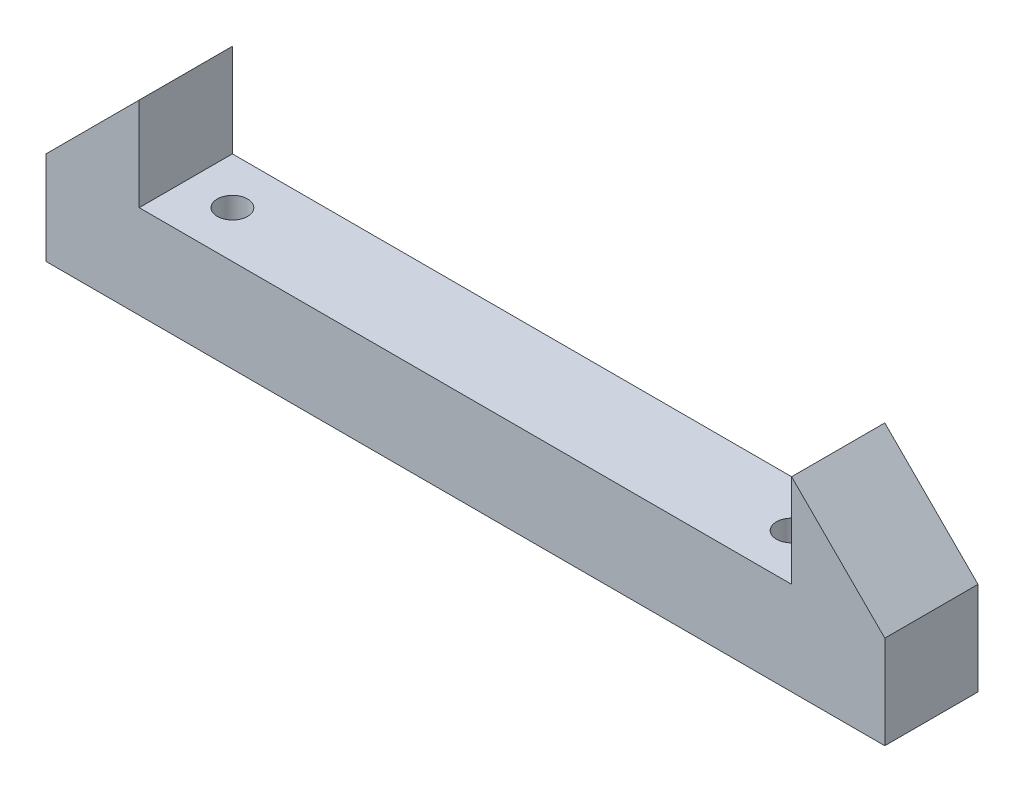
ISO-10303-21;
HEADER;
FILE_DESCRIPTION(('STEP AP214'),'2;1');
FILE_NAME('part.step','',(''),(''),'','','');
FILE_SCHEMA(('AUTOMOTIVE_DESIGN { 1 0 10303 214 1 1 1 1 }'));
ENDSEC;
DATA;
#1=APPLICATION_CONTEXT('core data for automotive mechanical design processes');
#2=APPLICATION_PROTOCOL_DEFINITION('international standard','automotive_design',2000,#1);
#3=PRODUCT_CONTEXT('',#1,'mechanical');
#4=PRODUCT('Part','Part','',(#3));
#5=PRODUCT_RELATED_PRODUCT_CATEGORY('part','',(#4));
#6=PRODUCT_DEFINITION_FORMATION('','',#4);
#7=PRODUCT_DEFINITION_CONTEXT('part definition',#1,'design');
#8=PRODUCT_DEFINITION('design','',#6,#7);
#9=PRODUCT_DEFINITION_SHAPE('','',#8);
#10=(LENGTH_UNIT() NAMED_UNIT(*) SI_UNIT(.MILLI.,.METRE.));
#11=(NAMED_UNIT(*) PLANE_ANGLE_UNIT() SI_UNIT($,.RADIAN.));
#12=(NAMED_UNIT(*) SI_UNIT($,.STERADIAN.) SOLID_ANGLE_UNIT());
#13=UNCERTAINTY_MEASURE_WITH_UNIT(LENGTH_MEASURE(1.E-05),#10,'distance_accuracy_value','');
#14=(GEOMETRIC_REPRESENTATION_CONTEXT(3) GLOBAL_UNCERTAINTY_ASSIGNED_CONTEXT((#13)) GLOBAL_UNIT_ASSIGNED_CONTEXT((#10,
#11,#12)) REPRESENTATION_CONTEXT('',''));
#15=CARTESIAN_POINT('',(0.,0.,0.));
#16=DIRECTION('',(0.,0.,1.));
#17=DIRECTION('',(1.,0.,0.));
#18=AXIS2_PLACEMENT_3D('',#15,#16,#17);
#19=CARTESIAN_POINT('',(-50.639022839575,-36.6403326403327,8.));
#20=DIRECTION('',(1.,0.,0.));
#21=DIRECTION('',(0.,0.,-1.));
#22=AXIS2_PLACEMENT_3D('',#19,#20,#21);
#23=PLANE('',#22);
#24=DIRECTION('',(0.,-1.,0.));
#25=VECTOR('',#24,1.);
#26=CARTESIAN_POINT('',(-50.639022839575,-36.6403326403327,0.));
#27=LINE('',#26,#25);
#28=CARTESIAN_POINT('',(-50.639022839575,-36.6403326403327,0.));
#29=VERTEX_POINT('',#28);
#30=CARTESIAN_POINT('',(-50.639022839575,-44.6403326403327,0.));
#31=VERTEX_POINT('',#30);
#32=EDGE_CURVE('E140',#29,#31,#27,.T.);
#33=ORIENTED_EDGE('',*,*,#32,.T.);
#34=DIRECTION('',(0.,0.,-1.));
#35=VECTOR('',#34,1.);
#36=CARTESIAN_POINT('',(-50.639022839575,-44.6403326403327,8.));
#37=LINE('',#36,#35);
#38=CARTESIAN_POINT('',(-50.639022839575,-44.6403326403327,8.));
#39=VERTEX_POINT('',#38);
#40=EDGE_CURVE('E11',#39,#31,#37,.T.);
#41=ORIENTED_EDGE('',*,*,#40,.F.);
#42=DIRECTION('',(0.,-1.,0.));
#43=VECTOR('',#42,1.);
#44=CARTESIAN_POINT('',(-50.639022839575,-36.6403326403327,8.));
#45=LINE('',#44,#43);
#46=CARTESIAN_POINT('',(-50.639022839575,-36.6403326403327,8.));
#47=VERTEX_POINT('',#46);
#48=EDGE_CURVE('E155',#47,#39,#45,.T.);
#49=ORIENTED_EDGE('',*,*,#48,.F.);
#50=DIRECTION('',(0.,0.,-1.));
#51=VECTOR('',#50,1.);
#52=CARTESIAN_POINT('',(-50.639022839575,-36.6403326403327,8.));
#53=LINE('',#52,#51);
#54=EDGE_CURVE('E135',#47,#29,#53,.T.);
#55=ORIENTED_EDGE('',*,*,#54,.T.);
#56=EDGE_LOOP('',(#33,#41,#49,#55));
#57=FACE_BOUND('',#56,.T.);
#58=ADVANCED_FACE('F41',(#57),#23,.F.);
#59=CARTESIAN_POINT('',(-50.639022839575,-44.6403326403327,8.));
#60=DIRECTION('',(0.,1.,0.));
#61=DIRECTION('',(-1.,0.,0.));
#62=AXIS2_PLACEMENT_3D('',#59,#60,#61);
#63=PLANE('',#62);
#64=CARTESIAN_POINT('',(9.36097716042498,-44.6403326403327,4.));
#65=DIRECTION('',(0.,1.,0.));
#66=DIRECTION('',(-1.,0.,0.));
#67=AXIS2_PLACEMENT_3D('',#64,#65,#66);
#68=CIRCLE('',#67,1.3);
#69=CARTESIAN_POINT('',(8.06097716042498,-44.6403326403327,4.));
#70=VERTEX_POINT('',#69);
#71=EDGE_CURVE('E143',#70,#70,#68,.F.);
#72=ORIENTED_EDGE('',*,*,#71,.F.);
#73=EDGE_LOOP('',(#72));
#74=FACE_BOUND('',#73,.T.);
#75=CARTESIAN_POINT('',(-38.639022839575,-44.6403326403327,4.00000000000001));
#76=DIRECTION('',(0.,1.,0.));
#77=DIRECTION('',(-1.,0.,0.));
#78=AXIS2_PLACEMENT_3D('',#75,#76,#77);
#79=CIRCLE('',#78,1.29999999999999);
#80=CARTESIAN_POINT('',(-39.939022839575,-44.6403326403327,4.00000000000001));
#81=VERTEX_POINT('',#80);
#82=EDGE_CURVE('E188',#81,#81,#79,.F.);
#83=ORIENTED_EDGE('',*,*,#82,.F.);
#84=EDGE_LOOP('',(#83));
#85=FACE_BOUND('',#84,.T.);
#86=DIRECTION('',(1.,0.,0.));
#87=VECTOR('',#86,1.);
#88=CARTESIAN_POINT('',(-50.639022839575,-44.6403326403327,0.));
#89=LINE('',#88,#87);
#90=CARTESIAN_POINT('',(21.360977160425,-44.6403326403327,0.));
#91=VERTEX_POINT('',#90);
#92=EDGE_CURVE('E138',#31,#91,#89,.T.);
#93=ORIENTED_EDGE('',*,*,#92,.T.);
#94=DIRECTION('',(0.,0.,-1.));
#95=VECTOR('',#94,1.);
#96=CARTESIAN_POINT('',(21.360977160425,-44.6403326403327,8.));
#97=LINE('',#96,#95);
#98=CARTESIAN_POINT('',(21.360977160425,-44.6403326403327,8.));
#99=VERTEX_POINT('',#98);
#100=EDGE_CURVE('E47',#99,#91,#97,.T.);
#101=ORIENTED_EDGE('',*,*,#100,.F.);
#102=DIRECTION('',(1.,0.,0.));
#103=VECTOR('',#102,1.);
#104=CARTESIAN_POINT('',(-50.639022839575,-44.6403326403327,8.));
#105=LINE('',#104,#103);
#106=EDGE_CURVE('E99',#39,#99,#105,.T.);
#107=ORIENTED_EDGE('',*,*,#106,.F.);
#108=ORIENTED_EDGE('',*,*,#40,.T.);
#109=EDGE_LOOP('',(#93,#101,#107,#108));
#110=FACE_BOUND('',#109,.T.);
#111=ADVANCED_FACE('F211',(#74,#85,#110),#63,.F.);
#112=CARTESIAN_POINT('',(21.360977160425,-44.6403326403327,8.));
#113=DIRECTION('',(-1.,0.,0.));
#114=DIRECTION('',(0.,0.,1.));
#115=AXIS2_PLACEMENT_3D('',#112,#113,#114);
#116=PLANE('',#115);
#117=DIRECTION('',(0.,1.,0.));
#118=VECTOR('',#117,1.);
#119=CARTESIAN_POINT('',(21.360977160425,-44.6403326403327,0.));
#120=LINE('',#119,#118);
#121=CARTESIAN_POINT('',(21.360977160425,-36.6403326403327,0.));
#122=VERTEX_POINT('',#121);
#123=EDGE_CURVE('E141',#91,#122,#120,.T.);
#124=ORIENTED_EDGE('',*,*,#123,.T.);
#125=DIRECTION('',(0.,0.,-1.));
#126=VECTOR('',#125,1.);
#127=CARTESIAN_POINT('',(21.360977160425,-36.6403326403327,8.));
#128=LINE('',#127,#126);
#129=CARTESIAN_POINT('',(21.360977160425,-36.6403326403327,8.));
#130=VERTEX_POINT('',#129);
#131=EDGE_CURVE('E157',#130,#122,#128,.T.);
#132=ORIENTED_EDGE('',*,*,#131,.F.);
#133=DIRECTION('',(0.,1.,0.));
#134=VECTOR('',#133,1.);
#135=CARTESIAN_POINT('',(21.360977160425,-44.6403326403327,8.));
#136=LINE('',#135,#134);
#137=EDGE_CURVE('E170',#99,#130,#136,.T.);
#138=ORIENTED_EDGE('',*,*,#137,.F.);
#139=ORIENTED_EDGE('',*,*,#100,.T.);
#140=EDGE_LOOP('',(#124,#132,#138,#139));
#141=FACE_BOUND('',#140,.T.);
#142=ADVANCED_FACE('F164',(#141),#116,.F.);
#143=CARTESIAN_POINT('',(21.360977160425,-36.6403326403327,8.));
#144=DIRECTION('',(-0.707106781186548,-0.707106781186547,0.));
#145=DIRECTION('',(0.707106781186547,-0.707106781186548,0.));
#146=AXIS2_PLACEMENT_3D('',#143,#144,#145);
#147=PLANE('',#146);
#148=DIRECTION('',(-0.707106781186547,0.707106781186548,0.));
#149=VECTOR('',#148,1.);
#150=CARTESIAN_POINT('',(21.360977160425,-36.6403326403327,0.));
#151=LINE('',#150,#149);
#152=CARTESIAN_POINT('',(13.360977160425,-28.6403326403327,0.));
#153=VERTEX_POINT('',#152);
#154=EDGE_CURVE('E144',#122,#153,#151,.T.);
#155=ORIENTED_EDGE('',*,*,#154,.T.);
#156=DIRECTION('',(0.,0.,-1.));
#157=VECTOR('',#156,1.);
#158=CARTESIAN_POINT('',(13.360977160425,-28.6403326403327,8.));
#159=LINE('',#158,#157);
#160=CARTESIAN_POINT('',(13.360977160425,-28.6403326403327,8.));
#161=VERTEX_POINT('',#160);
#162=EDGE_CURVE('E156',#161,#153,#159,.T.);
#163=ORIENTED_EDGE('',*,*,#162,.F.);
#164=DIRECTION('',(-0.707106781186547,0.707106781186548,0.));
#165=VECTOR('',#164,1.);
#166=CARTESIAN_POINT('',(21.360977160425,-36.6403326403327,8.));
#167=LINE('',#166,#165);
#168=EDGE_CURVE('E176',#130,#161,#167,.T.);
#169=ORIENTED_EDGE('',*,*,#168,.F.);
#170=ORIENTED_EDGE('',*,*,#131,.T.);
#171=EDGE_LOOP('',(#155,#163,#169,#170));
#172=FACE_BOUND('',#171,.T.);
#173=ADVANCED_FACE('F172',(#172),#147,.F.);
#174=CARTESIAN_POINT('',(13.360977160425,-28.6403326403327,8.));
#175=DIRECTION('',(1.,0.,0.));
#176=DIRECTION('',(0.,1.,0.));
#177=AXIS2_PLACEMENT_3D('',#174,#175,#176);
#178=PLANE('',#177);
#179=DIRECTION('',(0.,-1.,0.));
#180=VECTOR('',#179,1.);
#181=CARTESIAN_POINT('',(13.360977160425,-28.6403326403327,0.));
#182=LINE('',#181,#180);
#183=CARTESIAN_POINT('',(13.360977160425,-36.6403326403327,0.));
#184=VERTEX_POINT('',#183);
#185=EDGE_CURVE('E150',#153,#184,#182,.T.);
#186=ORIENTED_EDGE('',*,*,#185,.T.);
#187=DIRECTION('',(0.,0.,-1.));
#188=VECTOR('',#187,1.);
#189=CARTESIAN_POINT('',(13.360977160425,-36.6403326403327,8.));
#190=LINE('',#189,#188);
#191=CARTESIAN_POINT('',(13.360977160425,-36.6403326403327,8.));
#192=VERTEX_POINT('',#191);
#193=EDGE_CURVE('E126',#192,#184,#190,.T.);
#194=ORIENTED_EDGE('',*,*,#193,.F.);
#195=DIRECTION('',(0.,-1.,0.));
#196=VECTOR('',#195,1.);
#197=CARTESIAN_POINT('',(13.360977160425,-28.6403326403327,8.));
#198=LINE('',#197,#196);
#199=EDGE_CURVE('E118',#161,#192,#198,.T.);
#200=ORIENTED_EDGE('',*,*,#199,.F.);
#201=ORIENTED_EDGE('',*,*,#162,.T.);
#202=EDGE_LOOP('',(#186,#194,#200,#201));
#203=FACE_BOUND('',#202,.T.);
#204=ADVANCED_FACE('F179',(#203),#178,.F.);
#205=CARTESIAN_POINT('',(13.360977160425,-36.6403326403327,8.));
#206=DIRECTION('',(0.,-1.,0.));
#207=DIRECTION('',(0.,0.,-1.));
#208=AXIS2_PLACEMENT_3D('',#205,#206,#207);
#209=PLANE('',#208);
#210=CARTESIAN_POINT('',(9.36097716042498,-36.6403326403327,4.));
#211=DIRECTION('',(0.,1.,0.));
#212=DIRECTION('',(0.,0.,1.));
#213=AXIS2_PLACEMENT_3D('',#210,#211,#212);
#214=CIRCLE('',#213,1.3);
#215=CARTESIAN_POINT('',(9.36097716042498,-36.6403326403327,5.3));
#216=VERTEX_POINT('',#215);
#217=EDGE_CURVE('E190',#216,#216,#214,.T.);
#218=ORIENTED_EDGE('',*,*,#217,.F.);
#219=EDGE_LOOP('',(#218));
#220=FACE_BOUND('',#219,.T.);
#221=CARTESIAN_POINT('',(-38.639022839575,-36.6403326403327,4.00000000000001));
#222=DIRECTION('',(0.,1.,0.));
#223=DIRECTION('',(0.,0.,-1.));
#224=AXIS2_PLACEMENT_3D('',#221,#222,#223);
#225=CIRCLE('',#224,1.29999999999999);
#226=CARTESIAN_POINT('',(-38.639022839575,-36.6403326403327,2.70000000000001));
#227=VERTEX_POINT('',#226);
#228=EDGE_CURVE('E183',#227,#227,#225,.T.);
#229=ORIENTED_EDGE('',*,*,#228,.F.);
#230=EDGE_LOOP('',(#229));
#231=FACE_BOUND('',#230,.T.);
#232=DIRECTION('',(-1.,0.,0.));
#233=VECTOR('',#232,1.);
#234=CARTESIAN_POINT('',(13.360977160425,-36.6403326403327,0.));
#235=LINE('',#234,#233);
#236=CARTESIAN_POINT('',(-42.639022839575,-36.6403326403327,0.));
#237=VERTEX_POINT('',#236);
#238=EDGE_CURVE('E130',#184,#237,#235,.T.);
#239=ORIENTED_EDGE('',*,*,#238,.T.);
#240=DIRECTION('',(0.,0.,-1.));
#241=VECTOR('',#240,1.);
#242=CARTESIAN_POINT('',(-42.639022839575,-36.6403326403327,8.));
#243=LINE('',#242,#241);
#244=CARTESIAN_POINT('',(-42.639022839575,-36.6403326403327,8.));
#245=VERTEX_POINT('',#244);
#246=EDGE_CURVE('E121',#245,#237,#243,.T.);
#247=ORIENTED_EDGE('',*,*,#246,.F.);
#248=DIRECTION('',(-1.,0.,0.));
#249=VECTOR('',#248,1.);
#250=CARTESIAN_POINT('',(13.360977160425,-36.6403326403327,8.));
#251=LINE('',#250,#249);
#252=EDGE_CURVE('E114',#192,#245,#251,.T.);
#253=ORIENTED_EDGE('',*,*,#252,.F.);
#254=ORIENTED_EDGE('',*,*,#193,.T.);
#255=EDGE_LOOP('',(#239,#247,#253,#254));
#256=FACE_BOUND('',#255,.T.);
#257=ADVANCED_FACE('F123',(#220,#231,#256),#209,.F.);
#258=CARTESIAN_POINT('',(-42.639022839575,-36.6403326403327,8.));
#259=DIRECTION('',(-1.,0.,0.));
#260=DIRECTION('',(0.,0.,1.));
#261=AXIS2_PLACEMENT_3D('',#258,#259,#260);
#262=PLANE('',#261);
#263=DIRECTION('',(0.,1.,0.));
#264=VECTOR('',#263,1.);
#265=CARTESIAN_POINT('',(-42.639022839575,-36.6403326403327,0.));
#266=LINE('',#265,#264);
#267=CARTESIAN_POINT('',(-42.639022839575,-28.6403326403327,0.));
#268=VERTEX_POINT('',#267);
#269=EDGE_CURVE('E88',#237,#268,#266,.T.);
#270=ORIENTED_EDGE('',*,*,#269,.T.);
#271=DIRECTION('',(0.,0.,-1.));
#272=VECTOR('',#271,1.);
#273=CARTESIAN_POINT('',(-42.639022839575,-28.6403326403327,8.));
#274=LINE('',#273,#272);
#275=CARTESIAN_POINT('',(-42.639022839575,-28.6403326403327,8.));
#276=VERTEX_POINT('',#275);
#277=EDGE_CURVE('E129',#276,#268,#274,.T.);
#278=ORIENTED_EDGE('',*,*,#277,.F.);
#279=DIRECTION('',(0.,1.,0.));
#280=VECTOR('',#279,1.);
#281=CARTESIAN_POINT('',(-42.639022839575,-36.6403326403327,8.));
#282=LINE('',#281,#280);
#283=EDGE_CURVE('E116',#245,#276,#282,.T.);
#284=ORIENTED_EDGE('',*,*,#283,.F.);
#285=ORIENTED_EDGE('',*,*,#246,.T.);
#286=EDGE_LOOP('',(#270,#278,#284,#285));
#287=FACE_BOUND('',#286,.T.);
#288=ADVANCED_FACE('F134',(#287),#262,.F.);
#289=CARTESIAN_POINT('',(-42.639022839575,-28.6403326403327,8.));
#290=DIRECTION('',(0.707106781186548,-0.707106781186547,0.));
#291=DIRECTION('',(0.707106781186547,0.707106781186548,0.));
#292=AXIS2_PLACEMENT_3D('',#289,#290,#291);
#293=PLANE('',#292);
#294=DIRECTION('',(-0.707106781186547,-0.707106781186548,0.));
#295=VECTOR('',#294,1.);
#296=CARTESIAN_POINT('',(-42.639022839575,-28.6403326403327,0.));
#297=LINE('',#296,#295);
#298=EDGE_CURVE('E95',#268,#29,#297,.T.);
#299=ORIENTED_EDGE('',*,*,#298,.T.);
#300=ORIENTED_EDGE('',*,*,#54,.F.);
#301=DIRECTION('',(-0.707106781186547,-0.707106781186548,0.));
#302=VECTOR('',#301,1.);
#303=CARTESIAN_POINT('',(-42.639022839575,-28.6403326403327,8.));
#304=LINE('',#303,#302);
#305=EDGE_CURVE('E60',#276,#47,#304,.T.);
#306=ORIENTED_EDGE('',*,*,#305,.F.);
#307=ORIENTED_EDGE('',*,*,#277,.T.);
#308=EDGE_LOOP('',(#299,#300,#306,#307));
#309=FACE_BOUND('',#308,.T.);
#310=ADVANCED_FACE('F220',(#309),#293,.F.);
#311=CARTESIAN_POINT('',(0.,0.,8.));
#312=DIRECTION('',(0.,0.,1.));
#313=DIRECTION('',(1.,0.,0.));
#314=AXIS2_PLACEMENT_3D('',#311,#312,#313);
#315=PLANE('',#314);
#316=ORIENTED_EDGE('',*,*,#48,.T.);
#317=ORIENTED_EDGE('',*,*,#106,.T.);
#318=ORIENTED_EDGE('',*,*,#137,.T.);
#319=ORIENTED_EDGE('',*,*,#168,.T.);
#320=ORIENTED_EDGE('',*,*,#199,.T.);
#321=ORIENTED_EDGE('',*,*,#252,.T.);
#322=ORIENTED_EDGE('',*,*,#283,.T.);
#323=ORIENTED_EDGE('',*,*,#305,.T.);
#324=EDGE_LOOP('',(#316,#317,#318,#319,#320,#321,#322,#323));
#325=FACE_BOUND('',#324,.T.);
#326=ADVANCED_FACE('F113',(#325),#315,.T.);
#327=CARTESIAN_POINT('',(0.,0.,0.));
#328=DIRECTION('',(0.,0.,1.));
#329=DIRECTION('',(1.,0.,0.));
#330=AXIS2_PLACEMENT_3D('',#327,#328,#329);
#331=PLANE('',#330);
#332=ORIENTED_EDGE('',*,*,#32,.F.);
#333=ORIENTED_EDGE('',*,*,#298,.F.);
#334=ORIENTED_EDGE('',*,*,#269,.F.);
#335=ORIENTED_EDGE('',*,*,#238,.F.);
#336=ORIENTED_EDGE('',*,*,#185,.F.);
#337=ORIENTED_EDGE('',*,*,#154,.F.);
#338=ORIENTED_EDGE('',*,*,#123,.F.);
#339=ORIENTED_EDGE('',*,*,#92,.F.);
#340=EDGE_LOOP('',(#332,#333,#334,#335,#336,#337,#338,#339));
#341=FACE_BOUND('',#340,.T.);
#342=ADVANCED_FACE('F174',(#341),#331,.F.);
#343=CARTESIAN_POINT('',(-38.639022839575,-44.6413326403327,4.00000000000001));
#344=DIRECTION('',(0.,1.,0.));
#345=DIRECTION('',(0.,0.,1.));
#346=AXIS2_PLACEMENT_3D('',#343,#344,#345);
#347=CYLINDRICAL_SURFACE('',#346,1.29999999999999);
#348=ORIENTED_EDGE('',*,*,#228,.T.);
#349=EDGE_LOOP('',(#348));
#350=FACE_BOUND('',#349,.T.);
#351=ORIENTED_EDGE('',*,*,#82,.T.);
#352=EDGE_LOOP('',(#351));
#353=FACE_BOUND('',#352,.T.);
#354=ADVANCED_FACE('F202',(#350,#353),#347,.F.);
#355=CARTESIAN_POINT('',(9.36097716042498,-44.6413326403327,4.));
#356=DIRECTION('',(0.,1.,0.));
#357=DIRECTION('',(0.,0.,1.));
#358=AXIS2_PLACEMENT_3D('',#355,#356,#357);
#359=CYLINDRICAL_SURFACE('',#358,1.3);
#360=ORIENTED_EDGE('',*,*,#217,.T.);
#361=EDGE_LOOP('',(#360));
#362=FACE_BOUND('',#361,.T.);
#363=ORIENTED_EDGE('',*,*,#71,.T.);
#364=EDGE_LOOP('',(#363));
#365=FACE_BOUND('',#364,.T.);
#366=ADVANCED_FACE('F197',(#362,#365),#359,.F.);
#367=CLOSED_SHELL('',(#58,#111,#142,#173,#204,#257,#288,#310,#326,#342,#354,#366));
#368=MANIFOLD_SOLID_BREP('B2',#367);
#369=ADVANCED_BREP_SHAPE_REPRESENTATION('',(#18,#368),#14);
#370=SHAPE_DEFINITION_REPRESENTATION(#9,#369);
ENDSEC;
END-ISO-10303-21;
